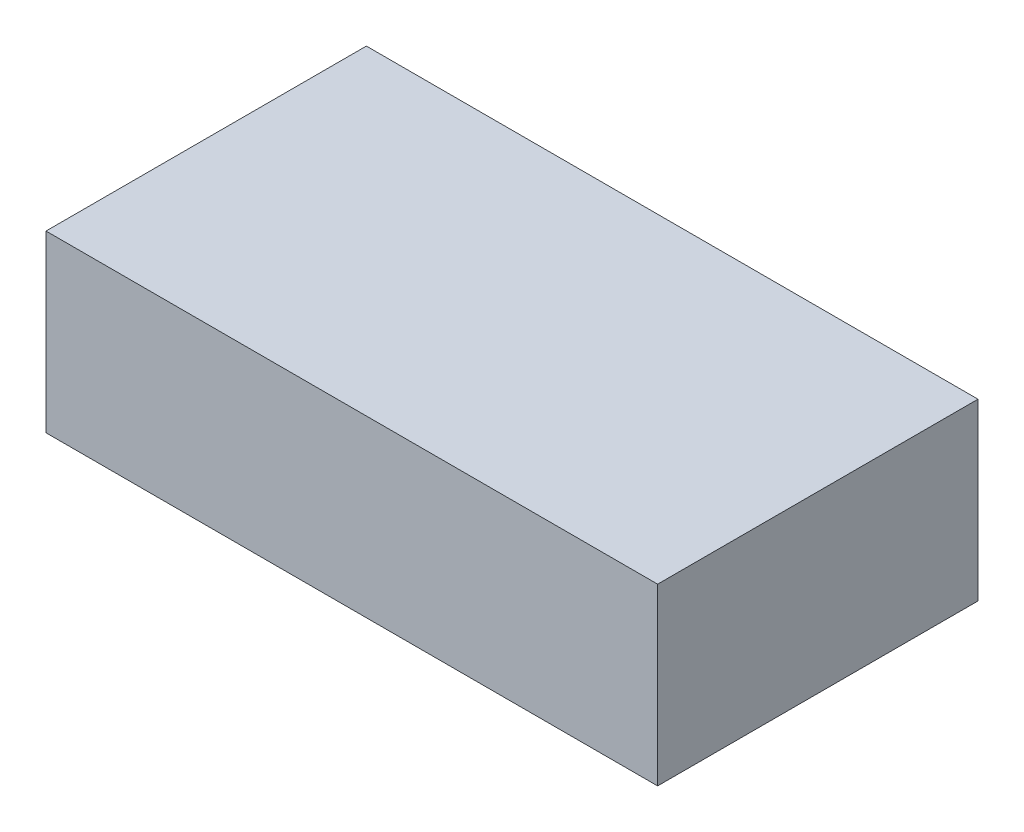
ISO-10303-21;
HEADER;
FILE_DESCRIPTION(('STEP AP214'),'2;1');
FILE_NAME('part.step','',(''),(''),'','','');
FILE_SCHEMA(('AUTOMOTIVE_DESIGN { 1 0 10303 214 1 1 1 1 }'));
ENDSEC;
DATA;
#1=APPLICATION_CONTEXT('core data for automotive mechanical design processes');
#2=APPLICATION_PROTOCOL_DEFINITION('international standard','automotive_design',2000,#1);
#3=PRODUCT_CONTEXT('',#1,'mechanical');
#4=PRODUCT('Part','Part','',(#3));
#5=PRODUCT_RELATED_PRODUCT_CATEGORY('part','',(#4));
#6=PRODUCT_DEFINITION_FORMATION('','',#4);
#7=PRODUCT_DEFINITION_CONTEXT('part definition',#1,'design');
#8=PRODUCT_DEFINITION('design','',#6,#7);
#9=PRODUCT_DEFINITION_SHAPE('','',#8);
#10=(LENGTH_UNIT() NAMED_UNIT(*) SI_UNIT(.MILLI.,.METRE.));
#11=(NAMED_UNIT(*) PLANE_ANGLE_UNIT() SI_UNIT($,.RADIAN.));
#12=(NAMED_UNIT(*) SI_UNIT($,.STERADIAN.) SOLID_ANGLE_UNIT());
#13=UNCERTAINTY_MEASURE_WITH_UNIT(LENGTH_MEASURE(1.E-05),#10,'distance_accuracy_value','');
#14=(GEOMETRIC_REPRESENTATION_CONTEXT(3) GLOBAL_UNCERTAINTY_ASSIGNED_CONTEXT((#13)) GLOBAL_UNIT_ASSIGNED_CONTEXT((#10,
#11,#12)) REPRESENTATION_CONTEXT('',''));
#15=CARTESIAN_POINT('',(0.,0.,0.));
#16=DIRECTION('',(0.,0.,1.));
#17=DIRECTION('',(1.,0.,0.));
#18=AXIS2_PLACEMENT_3D('',#15,#16,#17);
#19=CARTESIAN_POINT('',(-4.1064,3.3256,5.313));
#20=DIRECTION('',(1.,0.,0.));
#21=DIRECTION('',(0.,0.,-1.));
#22=AXIS2_PLACEMENT_3D('',#19,#20,#21);
#23=PLANE('',#22);
#24=DIRECTION('',(0.,-1.,0.));
#25=VECTOR('',#24,1.);
#26=CARTESIAN_POINT('',(-4.1064,3.3256,5.313));
#27=LINE('',#26,#25);
#28=CARTESIAN_POINT('',(-4.1064,3.3256,5.313));
#29=VERTEX_POINT('',#28);
#30=CARTESIAN_POINT('',(-4.1064,3.0256,5.313));
#31=VERTEX_POINT('',#30);
#32=EDGE_CURVE('E11',#29,#31,#27,.T.);
#33=ORIENTED_EDGE('',*,*,#32,.T.);
#34=DIRECTION('',(0.,0.,1.));
#35=VECTOR('',#34,1.);
#36=CARTESIAN_POINT('',(-4.1064,3.0256,5.313));
#37=LINE('',#36,#35);
#38=CARTESIAN_POINT('',(-4.1064,3.0256,5.863));
#39=VERTEX_POINT('',#38);
#40=EDGE_CURVE('E24',#31,#39,#37,.T.);
#41=ORIENTED_EDGE('',*,*,#40,.T.);
#42=DIRECTION('',(0.,-1.,0.));
#43=VECTOR('',#42,1.);
#44=CARTESIAN_POINT('',(-4.1064,3.3256,5.863));
#45=LINE('',#44,#43);
#46=CARTESIAN_POINT('',(-4.1064,3.3256,5.863));
#47=VERTEX_POINT('',#46);
#48=EDGE_CURVE('E86',#47,#39,#45,.T.);
#49=ORIENTED_EDGE('',*,*,#48,.F.);
#50=DIRECTION('',(0.,0.,1.));
#51=VECTOR('',#50,1.);
#52=CARTESIAN_POINT('',(-4.1064,3.3256,5.313));
#53=LINE('',#52,#51);
#54=EDGE_CURVE('E84',#29,#47,#53,.T.);
#55=ORIENTED_EDGE('',*,*,#54,.F.);
#56=EDGE_LOOP('',(#33,#41,#49,#55));
#57=FACE_BOUND('',#56,.T.);
#58=ADVANCED_FACE('F17',(#57),#23,.F.);
#59=CARTESIAN_POINT('',(-3.0564,3.3256,5.863));
#60=DIRECTION('',(0.,0.,-1.));
#61=DIRECTION('',(-1.,0.,0.));
#62=AXIS2_PLACEMENT_3D('',#59,#60,#61);
#63=PLANE('',#62);
#64=ORIENTED_EDGE('',*,*,#48,.T.);
#65=DIRECTION('',(-1.,0.,0.));
#66=VECTOR('',#65,1.);
#67=CARTESIAN_POINT('',(-4.1064,3.0256,5.863));
#68=LINE('',#67,#66);
#69=CARTESIAN_POINT('',(-3.0564,3.0256,5.863));
#70=VERTEX_POINT('',#69);
#71=EDGE_CURVE('E81',#70,#39,#68,.T.);
#72=ORIENTED_EDGE('',*,*,#71,.F.);
#73=DIRECTION('',(0.,-1.,0.));
#74=VECTOR('',#73,1.);
#75=CARTESIAN_POINT('',(-3.0564,3.3256,5.863));
#76=LINE('',#75,#74);
#77=CARTESIAN_POINT('',(-3.0564,3.3256,5.863));
#78=VERTEX_POINT('',#77);
#79=EDGE_CURVE('E79',#78,#70,#76,.T.);
#80=ORIENTED_EDGE('',*,*,#79,.F.);
#81=DIRECTION('',(1.,0.,0.));
#82=VECTOR('',#81,1.);
#83=CARTESIAN_POINT('',(-3.0564,3.3256,5.863));
#84=LINE('',#83,#82);
#85=EDGE_CURVE('E70',#47,#78,#84,.T.);
#86=ORIENTED_EDGE('',*,*,#85,.F.);
#87=EDGE_LOOP('',(#64,#72,#80,#86));
#88=FACE_BOUND('',#87,.T.);
#89=ADVANCED_FACE('F90',(#88),#63,.F.);
#90=CARTESIAN_POINT('',(-3.0564,3.3256,5.313));
#91=DIRECTION('',(-1.,0.,0.));
#92=DIRECTION('',(0.,0.,1.));
#93=AXIS2_PLACEMENT_3D('',#90,#91,#92);
#94=PLANE('',#93);
#95=ORIENTED_EDGE('',*,*,#79,.T.);
#96=DIRECTION('',(0.,0.,1.));
#97=VECTOR('',#96,1.);
#98=CARTESIAN_POINT('',(-3.0564,3.0256,5.313));
#99=LINE('',#98,#97);
#100=CARTESIAN_POINT('',(-3.0564,3.0256,5.313));
#101=VERTEX_POINT('',#100);
#102=EDGE_CURVE('E60',#101,#70,#99,.T.);
#103=ORIENTED_EDGE('',*,*,#102,.F.);
#104=DIRECTION('',(0.,-1.,0.));
#105=VECTOR('',#104,1.);
#106=CARTESIAN_POINT('',(-3.0564,3.3256,5.313));
#107=LINE('',#106,#105);
#108=CARTESIAN_POINT('',(-3.0564,3.3256,5.313));
#109=VERTEX_POINT('',#108);
#110=EDGE_CURVE('E54',#109,#101,#107,.T.);
#111=ORIENTED_EDGE('',*,*,#110,.F.);
#112=DIRECTION('',(0.,0.,-1.));
#113=VECTOR('',#112,1.);
#114=CARTESIAN_POINT('',(-3.0564,3.3256,5.313));
#115=LINE('',#114,#113);
#116=EDGE_CURVE('E58',#78,#109,#115,.T.);
#117=ORIENTED_EDGE('',*,*,#116,.F.);
#118=EDGE_LOOP('',(#95,#103,#111,#117));
#119=FACE_BOUND('',#118,.T.);
#120=ADVANCED_FACE('F57',(#119),#94,.F.);
#121=CARTESIAN_POINT('',(-3.0564,3.3256,5.313));
#122=DIRECTION('',(0.,0.,1.));
#123=DIRECTION('',(1.,0.,0.));
#124=AXIS2_PLACEMENT_3D('',#121,#122,#123);
#125=PLANE('',#124);
#126=ORIENTED_EDGE('',*,*,#110,.T.);
#127=DIRECTION('',(-1.,0.,0.));
#128=VECTOR('',#127,1.);
#129=CARTESIAN_POINT('',(-4.1064,3.0256,5.313));
#130=LINE('',#129,#128);
#131=EDGE_CURVE('E71',#101,#31,#130,.T.);
#132=ORIENTED_EDGE('',*,*,#131,.T.);
#133=ORIENTED_EDGE('',*,*,#32,.F.);
#134=DIRECTION('',(-1.,0.,0.));
#135=VECTOR('',#134,1.);
#136=CARTESIAN_POINT('',(-3.0564,3.3256,5.313));
#137=LINE('',#136,#135);
#138=EDGE_CURVE('E68',#109,#29,#137,.T.);
#139=ORIENTED_EDGE('',*,*,#138,.F.);
#140=EDGE_LOOP('',(#126,#132,#133,#139));
#141=FACE_BOUND('',#140,.T.);
#142=ADVANCED_FACE('F73',(#141),#125,.F.);
#143=CARTESIAN_POINT('',(-4.1064,3.3256,5.863));
#144=DIRECTION('',(0.,-1.,0.));
#145=DIRECTION('',(0.,0.,-1.));
#146=AXIS2_PLACEMENT_3D('',#143,#144,#145);
#147=PLANE('',#146);
#148=ORIENTED_EDGE('',*,*,#54,.T.);
#149=ORIENTED_EDGE('',*,*,#85,.T.);
#150=ORIENTED_EDGE('',*,*,#116,.T.);
#151=ORIENTED_EDGE('',*,*,#138,.T.);
#152=EDGE_LOOP('',(#148,#149,#150,#151));
#153=FACE_BOUND('',#152,.T.);
#154=ADVANCED_FACE('F67',(#153),#147,.F.);
#155=CARTESIAN_POINT('',(-4.1064,3.0256,5.313));
#156=DIRECTION('',(0.,1.,0.));
#157=DIRECTION('',(-1.,0.,0.));
#158=AXIS2_PLACEMENT_3D('',#155,#156,#157);
#159=PLANE('',#158);
#160=ORIENTED_EDGE('',*,*,#71,.T.);
#161=ORIENTED_EDGE('',*,*,#40,.F.);
#162=ORIENTED_EDGE('',*,*,#131,.F.);
#163=ORIENTED_EDGE('',*,*,#102,.T.);
#164=EDGE_LOOP('',(#160,#161,#162,#163));
#165=FACE_BOUND('',#164,.T.);
#166=ADVANCED_FACE('F91',(#165),#159,.F.);
#167=CLOSED_SHELL('',(#58,#89,#120,#142,#154,#166));
#168=MANIFOLD_SOLID_BREP('B1',#167);
#169=ADVANCED_BREP_SHAPE_REPRESENTATION('',(#18,#168),#14);
#170=SHAPE_DEFINITION_REPRESENTATION(#9,#169);
ENDSEC;
END-ISO-10303-21;
